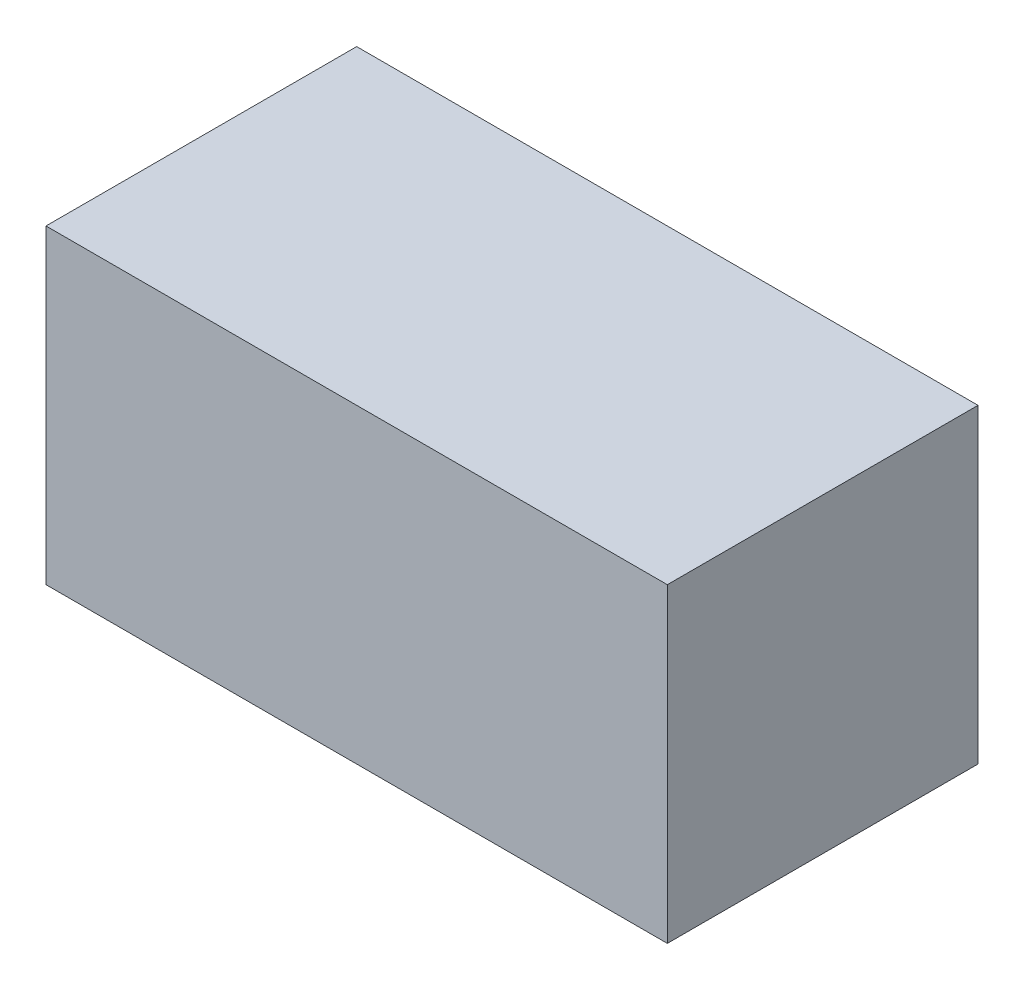
ISO-10303-21;
HEADER;
FILE_DESCRIPTION(('STEP AP214'),'2;1');
FILE_NAME('part.step','',(''),(''),'','','');
FILE_SCHEMA(('AUTOMOTIVE_DESIGN { 1 0 10303 214 1 1 1 1 }'));
ENDSEC;
DATA;
#1=APPLICATION_CONTEXT('core data for automotive mechanical design processes');
#2=APPLICATION_PROTOCOL_DEFINITION('international standard','automotive_design',2000,#1);
#3=PRODUCT_CONTEXT('',#1,'mechanical');
#4=PRODUCT('Part','Part','',(#3));
#5=PRODUCT_RELATED_PRODUCT_CATEGORY('part','',(#4));
#6=PRODUCT_DEFINITION_FORMATION('','',#4);
#7=PRODUCT_DEFINITION_CONTEXT('part definition',#1,'design');
#8=PRODUCT_DEFINITION('design','',#6,#7);
#9=PRODUCT_DEFINITION_SHAPE('','',#8);
#10=(LENGTH_UNIT() NAMED_UNIT(*) SI_UNIT(.MILLI.,.METRE.));
#11=(NAMED_UNIT(*) PLANE_ANGLE_UNIT() SI_UNIT($,.RADIAN.));
#12=(NAMED_UNIT(*) SI_UNIT($,.STERADIAN.) SOLID_ANGLE_UNIT());
#13=UNCERTAINTY_MEASURE_WITH_UNIT(LENGTH_MEASURE(1.E-05),#10,'distance_accuracy_value','');
#14=(GEOMETRIC_REPRESENTATION_CONTEXT(3) GLOBAL_UNCERTAINTY_ASSIGNED_CONTEXT((#13)) GLOBAL_UNIT_ASSIGNED_CONTEXT((#10,
#11,#12)) REPRESENTATION_CONTEXT('',''));
#15=CARTESIAN_POINT('',(0.,0.,0.));
#16=DIRECTION('',(0.,0.,1.));
#17=DIRECTION('',(1.,0.,0.));
#18=AXIS2_PLACEMENT_3D('',#15,#16,#17);
#19=CARTESIAN_POINT('',(0.,0.2,0.));
#20=DIRECTION('',(1.,0.,0.));
#21=DIRECTION('',(0.,0.,-1.));
#22=AXIS2_PLACEMENT_3D('',#19,#20,#21);
#23=PLANE('',#22);
#24=DIRECTION('',(0.,0.,1.));
#25=VECTOR('',#24,1.);
#26=CARTESIAN_POINT('',(0.,0.,0.));
#27=LINE('',#26,#25);
#28=CARTESIAN_POINT('',(0.,0.,-0.2));
#29=VERTEX_POINT('',#28);
#30=CARTESIAN_POINT('',(0.,0.,0.));
#31=VERTEX_POINT('',#30);
#32=EDGE_CURVE('E95',#29,#31,#27,.T.);
#33=ORIENTED_EDGE('',*,*,#32,.T.);
#34=DIRECTION('',(0.,-1.,0.));
#35=VECTOR('',#34,1.);
#36=CARTESIAN_POINT('',(0.,0.2,0.));
#37=LINE('',#36,#35);
#38=CARTESIAN_POINT('',(0.,0.2,0.));
#39=VERTEX_POINT('',#38);
#40=EDGE_CURVE('E11',#39,#31,#37,.T.);
#41=ORIENTED_EDGE('',*,*,#40,.F.);
#42=DIRECTION('',(0.,0.,1.));
#43=VECTOR('',#42,1.);
#44=CARTESIAN_POINT('',(0.,0.2,0.));
#45=LINE('',#44,#43);
#46=CARTESIAN_POINT('',(0.,0.2,-0.2));
#47=VERTEX_POINT('',#46);
#48=EDGE_CURVE('E83',#47,#39,#45,.T.);
#49=ORIENTED_EDGE('',*,*,#48,.F.);
#50=DIRECTION('',(0.,-1.,0.));
#51=VECTOR('',#50,1.);
#52=CARTESIAN_POINT('',(0.,0.2,-0.2));
#53=LINE('',#52,#51);
#54=EDGE_CURVE('E91',#47,#29,#53,.T.);
#55=ORIENTED_EDGE('',*,*,#54,.T.);
#56=EDGE_LOOP('',(#33,#41,#49,#55));
#57=FACE_BOUND('',#56,.T.);
#58=ADVANCED_FACE('F32',(#57),#23,.F.);
#59=CARTESIAN_POINT('',(0.,0.2,0.));
#60=DIRECTION('',(0.,0.,-1.));
#61=DIRECTION('',(-1.,0.,0.));
#62=AXIS2_PLACEMENT_3D('',#59,#60,#61);
#63=PLANE('',#62);
#64=DIRECTION('',(1.,0.,0.));
#65=VECTOR('',#64,1.);
#66=CARTESIAN_POINT('',(0.,0.,0.));
#67=LINE('',#66,#65);
#68=CARTESIAN_POINT('',(0.4,0.,0.));
#69=VERTEX_POINT('',#68);
#70=EDGE_CURVE('E87',#31,#69,#67,.T.);
#71=ORIENTED_EDGE('',*,*,#70,.T.);
#72=DIRECTION('',(0.,-1.,0.));
#73=VECTOR('',#72,1.);
#74=CARTESIAN_POINT('',(0.4,0.2,0.));
#75=LINE('',#74,#73);
#76=CARTESIAN_POINT('',(0.4,0.2,0.));
#77=VERTEX_POINT('',#76);
#78=EDGE_CURVE('E40',#77,#69,#75,.T.);
#79=ORIENTED_EDGE('',*,*,#78,.F.);
#80=DIRECTION('',(1.,0.,0.));
#81=VECTOR('',#80,1.);
#82=CARTESIAN_POINT('',(0.,0.2,0.));
#83=LINE('',#82,#81);
#84=EDGE_CURVE('E78',#39,#77,#83,.T.);
#85=ORIENTED_EDGE('',*,*,#84,.F.);
#86=ORIENTED_EDGE('',*,*,#40,.T.);
#87=EDGE_LOOP('',(#71,#79,#85,#86));
#88=FACE_BOUND('',#87,.T.);
#89=ADVANCED_FACE('F86',(#88),#63,.F.);
#90=CARTESIAN_POINT('',(0.4,0.2,0.));
#91=DIRECTION('',(-1.,0.,0.));
#92=DIRECTION('',(0.,0.,1.));
#93=AXIS2_PLACEMENT_3D('',#90,#91,#92);
#94=PLANE('',#93);
#95=DIRECTION('',(0.,0.,-1.));
#96=VECTOR('',#95,1.);
#97=CARTESIAN_POINT('',(0.4,0.,0.));
#98=LINE('',#97,#96);
#99=CARTESIAN_POINT('',(0.4,0.,-0.2));
#100=VERTEX_POINT('',#99);
#101=EDGE_CURVE('E65',#69,#100,#98,.T.);
#102=ORIENTED_EDGE('',*,*,#101,.T.);
#103=DIRECTION('',(0.,-1.,0.));
#104=VECTOR('',#103,1.);
#105=CARTESIAN_POINT('',(0.4,0.2,-0.2));
#106=LINE('',#105,#104);
#107=CARTESIAN_POINT('',(0.4,0.2,-0.2));
#108=VERTEX_POINT('',#107);
#109=EDGE_CURVE('E88',#108,#100,#106,.T.);
#110=ORIENTED_EDGE('',*,*,#109,.F.);
#111=DIRECTION('',(0.,0.,-1.));
#112=VECTOR('',#111,1.);
#113=CARTESIAN_POINT('',(0.4,0.2,0.));
#114=LINE('',#113,#112);
#115=EDGE_CURVE('E81',#77,#108,#114,.T.);
#116=ORIENTED_EDGE('',*,*,#115,.F.);
#117=ORIENTED_EDGE('',*,*,#78,.T.);
#118=EDGE_LOOP('',(#102,#110,#116,#117));
#119=FACE_BOUND('',#118,.T.);
#120=ADVANCED_FACE('F89',(#119),#94,.F.);
#121=CARTESIAN_POINT('',(0.,0.2,-0.2));
#122=DIRECTION('',(0.,0.,1.));
#123=DIRECTION('',(1.,0.,0.));
#124=AXIS2_PLACEMENT_3D('',#121,#122,#123);
#125=PLANE('',#124);
#126=DIRECTION('',(-1.,0.,0.));
#127=VECTOR('',#126,1.);
#128=CARTESIAN_POINT('',(0.,0.,-0.2));
#129=LINE('',#128,#127);
#130=EDGE_CURVE('E71',#100,#29,#129,.T.);
#131=ORIENTED_EDGE('',*,*,#130,.T.);
#132=ORIENTED_EDGE('',*,*,#54,.F.);
#133=DIRECTION('',(-1.,0.,0.));
#134=VECTOR('',#133,1.);
#135=CARTESIAN_POINT('',(0.,0.2,-0.2));
#136=LINE('',#135,#134);
#137=EDGE_CURVE('E48',#108,#47,#136,.T.);
#138=ORIENTED_EDGE('',*,*,#137,.F.);
#139=ORIENTED_EDGE('',*,*,#109,.T.);
#140=EDGE_LOOP('',(#131,#132,#138,#139));
#141=FACE_BOUND('',#140,.T.);
#142=ADVANCED_FACE('F102',(#141),#125,.F.);
#143=CARTESIAN_POINT('',(0.,0.2,0.));
#144=DIRECTION('',(0.,-1.,0.));
#145=DIRECTION('',(0.,0.,-1.));
#146=AXIS2_PLACEMENT_3D('',#143,#144,#145);
#147=PLANE('',#146);
#148=ORIENTED_EDGE('',*,*,#48,.T.);
#149=ORIENTED_EDGE('',*,*,#84,.T.);
#150=ORIENTED_EDGE('',*,*,#115,.T.);
#151=ORIENTED_EDGE('',*,*,#137,.T.);
#152=EDGE_LOOP('',(#148,#149,#150,#151));
#153=FACE_BOUND('',#152,.T.);
#154=ADVANCED_FACE('F79',(#153),#147,.F.);
#155=CARTESIAN_POINT('',(0.,0.,0.));
#156=DIRECTION('',(0.,-1.,0.));
#157=DIRECTION('',(0.,0.,-1.));
#158=AXIS2_PLACEMENT_3D('',#155,#156,#157);
#159=PLANE('',#158);
#160=ORIENTED_EDGE('',*,*,#32,.F.);
#161=ORIENTED_EDGE('',*,*,#130,.F.);
#162=ORIENTED_EDGE('',*,*,#101,.F.);
#163=ORIENTED_EDGE('',*,*,#70,.F.);
#164=EDGE_LOOP('',(#160,#161,#162,#163));
#165=FACE_BOUND('',#164,.T.);
#166=ADVANCED_FACE('F105',(#165),#159,.T.);
#167=CLOSED_SHELL('',(#58,#89,#120,#142,#154,#166));
#168=MANIFOLD_SOLID_BREP('B2',#167);
#169=ADVANCED_BREP_SHAPE_REPRESENTATION('',(#18,#168),#14);
#170=SHAPE_DEFINITION_REPRESENTATION(#9,#169);
ENDSEC;
END-ISO-10303-21;
